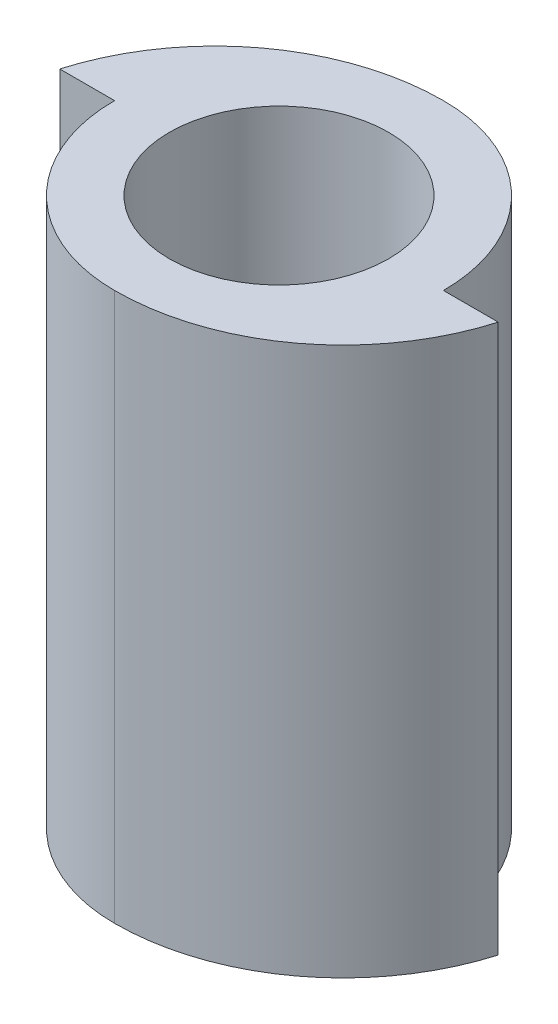
ISO-10303-21;
HEADER;
FILE_DESCRIPTION(('STEP AP214'),'2;1');
FILE_NAME('part.step','',(''),(''),'','','');
FILE_SCHEMA(('AUTOMOTIVE_DESIGN { 1 0 10303 214 1 1 1 1 }'));
ENDSEC;
DATA;
#1=APPLICATION_CONTEXT('core data for automotive mechanical design processes');
#2=APPLICATION_PROTOCOL_DEFINITION('international standard','automotive_design',2000,#1);
#3=PRODUCT_CONTEXT('',#1,'mechanical');
#4=PRODUCT('Part','Part','',(#3));
#5=PRODUCT_RELATED_PRODUCT_CATEGORY('part','',(#4));
#6=PRODUCT_DEFINITION_FORMATION('','',#4);
#7=PRODUCT_DEFINITION_CONTEXT('part definition',#1,'design');
#8=PRODUCT_DEFINITION('design','',#6,#7);
#9=PRODUCT_DEFINITION_SHAPE('','',#8);
#10=(LENGTH_UNIT() NAMED_UNIT(*) SI_UNIT(.MILLI.,.METRE.));
#11=(NAMED_UNIT(*) PLANE_ANGLE_UNIT() SI_UNIT($,.RADIAN.));
#12=(NAMED_UNIT(*) SI_UNIT($,.STERADIAN.) SOLID_ANGLE_UNIT());
#13=UNCERTAINTY_MEASURE_WITH_UNIT(LENGTH_MEASURE(1.E-05),#10,'distance_accuracy_value','');
#14=(GEOMETRIC_REPRESENTATION_CONTEXT(3) GLOBAL_UNCERTAINTY_ASSIGNED_CONTEXT((#13)) GLOBAL_UNIT_ASSIGNED_CONTEXT((#10,
#11,#12)) REPRESENTATION_CONTEXT('',''));
#15=CARTESIAN_POINT('',(0.,0.,0.));
#16=DIRECTION('',(0.,0.,1.));
#17=DIRECTION('',(1.,0.,0.));
#18=AXIS2_PLACEMENT_3D('',#15,#16,#17);
#19=CARTESIAN_POINT('',(0.,5.,0.));
#20=DIRECTION('',(0.,-1.,0.));
#21=DIRECTION('',(0.,0.,-1.));
#22=AXIS2_PLACEMENT_3D('',#19,#20,#21);
#23=CYLINDRICAL_SURFACE('',#22,1.5);
#24=CARTESIAN_POINT('',(0.,0.,0.));
#25=DIRECTION('',(0.,1.,0.));
#26=DIRECTION('',(0.,0.,1.));
#27=AXIS2_PLACEMENT_3D('',#24,#25,#26);
#28=CIRCLE('',#27,1.5);
#29=CARTESIAN_POINT('',(1.5,0.,0.));
#30=VERTEX_POINT('',#29);
#31=CARTESIAN_POINT('',(0.,0.,-1.5));
#32=VERTEX_POINT('',#31);
#33=EDGE_CURVE('E138',#30,#32,#28,.T.);
#34=ORIENTED_EDGE('',*,*,#33,.T.);
#35=DIRECTION('',(0.,-1.,0.));
#36=VECTOR('',#35,1.);
#37=CARTESIAN_POINT('',(0.,5.,-1.5));
#38=LINE('',#37,#36);
#39=CARTESIAN_POINT('',(0.,5.,-1.5));
#40=VERTEX_POINT('',#39);
#41=EDGE_CURVE('E11',#40,#32,#38,.T.);
#42=ORIENTED_EDGE('',*,*,#41,.F.);
#43=CARTESIAN_POINT('',(0.,5.,0.));
#44=DIRECTION('',(0.,1.,0.));
#45=DIRECTION('',(0.,0.,1.));
#46=AXIS2_PLACEMENT_3D('',#43,#44,#45);
#47=CIRCLE('',#46,1.5);
#48=CARTESIAN_POINT('',(1.5,5.,0.));
#49=VERTEX_POINT('',#48);
#50=EDGE_CURVE('E283',#49,#40,#47,.T.);
#51=ORIENTED_EDGE('',*,*,#50,.F.);
#52=DIRECTION('',(0.,-1.,0.));
#53=VECTOR('',#52,1.);
#54=CARTESIAN_POINT('',(1.5,5.,0.));
#55=LINE('',#54,#53);
#56=EDGE_CURVE('E61',#49,#30,#55,.T.);
#57=ORIENTED_EDGE('',*,*,#56,.T.);
#58=EDGE_LOOP('',(#34,#42,#51,#57));
#59=FACE_BOUND('',#58,.T.);
#60=ADVANCED_FACE('F43',(#59),#23,.T.);
#61=CARTESIAN_POINT('',(0.,5.,0.583333333333334));
#62=DIRECTION('',(0.,-1.,0.));
#63=DIRECTION('',(0.,0.,-1.));
#64=AXIS2_PLACEMENT_3D('',#61,#62,#63);
#65=CYLINDRICAL_SURFACE('',#64,2.08333333333333);
#66=CARTESIAN_POINT('',(0.,0.,0.583333333333334));
#67=DIRECTION('',(0.,1.,0.));
#68=DIRECTION('',(0.,0.,1.));
#69=AXIS2_PLACEMENT_3D('',#66,#67,#68);
#70=CIRCLE('',#69,2.08333333333333);
#71=CARTESIAN_POINT('',(-2.,0.,0.));
#72=VERTEX_POINT('',#71);
#73=EDGE_CURVE('E141',#32,#72,#70,.T.);
#74=ORIENTED_EDGE('',*,*,#73,.T.);
#75=DIRECTION('',(0.,-1.,0.));
#76=VECTOR('',#75,1.);
#77=CARTESIAN_POINT('',(-2.,5.,0.));
#78=LINE('',#77,#76);
#79=CARTESIAN_POINT('',(-2.,5.,0.));
#80=VERTEX_POINT('',#79);
#81=EDGE_CURVE('E53',#80,#72,#78,.T.);
#82=ORIENTED_EDGE('',*,*,#81,.F.);
#83=CARTESIAN_POINT('',(0.,5.,0.583333333333334));
#84=DIRECTION('',(0.,1.,0.));
#85=DIRECTION('',(0.,0.,1.));
#86=AXIS2_PLACEMENT_3D('',#83,#84,#85);
#87=CIRCLE('',#86,2.08333333333333);
#88=EDGE_CURVE('E94',#40,#80,#87,.T.);
#89=ORIENTED_EDGE('',*,*,#88,.F.);
#90=ORIENTED_EDGE('',*,*,#41,.T.);
#91=EDGE_LOOP('',(#74,#82,#89,#90));
#92=FACE_BOUND('',#91,.T.);
#93=ADVANCED_FACE('F182',(#92),#65,.T.);
#94=CARTESIAN_POINT('',(0.,5.,0.));
#95=DIRECTION('',(0.,0.,-1.));
#96=DIRECTION('',(-1.,0.,0.));
#97=AXIS2_PLACEMENT_3D('',#94,#95,#96);
#98=PLANE('',#97);
#99=DIRECTION('',(1.,0.,0.));
#100=VECTOR('',#99,1.);
#101=CARTESIAN_POINT('',(0.,0.,0.));
#102=LINE('',#101,#100);
#103=CARTESIAN_POINT('',(-1.5,0.,0.));
#104=VERTEX_POINT('',#103);
#105=EDGE_CURVE('E144',#72,#104,#102,.T.);
#106=ORIENTED_EDGE('',*,*,#105,.T.);
#107=DIRECTION('',(0.,-1.,0.));
#108=VECTOR('',#107,1.);
#109=CARTESIAN_POINT('',(-1.5,5.,0.));
#110=LINE('',#109,#108);
#111=CARTESIAN_POINT('',(-1.5,5.,0.));
#112=VERTEX_POINT('',#111);
#113=EDGE_CURVE('E124',#112,#104,#110,.T.);
#114=ORIENTED_EDGE('',*,*,#113,.F.);
#115=DIRECTION('',(1.,0.,0.));
#116=VECTOR('',#115,1.);
#117=CARTESIAN_POINT('',(0.,5.,0.));
#118=LINE('',#117,#116);
#119=EDGE_CURVE('E110',#80,#112,#118,.T.);
#120=ORIENTED_EDGE('',*,*,#119,.F.);
#121=ORIENTED_EDGE('',*,*,#81,.T.);
#122=EDGE_LOOP('',(#106,#114,#120,#121));
#123=FACE_BOUND('',#122,.T.);
#124=ADVANCED_FACE('F166',(#123),#98,.F.);
#125=CARTESIAN_POINT('',(0.,5.,0.));
#126=DIRECTION('',(0.,-1.,0.));
#127=DIRECTION('',(0.,0.,-1.));
#128=AXIS2_PLACEMENT_3D('',#125,#126,#127);
#129=CYLINDRICAL_SURFACE('',#128,1.5);
#130=CARTESIAN_POINT('',(0.,0.,0.));
#131=DIRECTION('',(0.,1.,0.));
#132=DIRECTION('',(0.,0.,1.));
#133=AXIS2_PLACEMENT_3D('',#130,#131,#132);
#134=CIRCLE('',#133,1.5);
#135=CARTESIAN_POINT('',(0.,0.,1.5));
#136=VERTEX_POINT('',#135);
#137=EDGE_CURVE('E120',#104,#136,#134,.T.);
#138=ORIENTED_EDGE('',*,*,#137,.T.);
#139=DIRECTION('',(0.,-1.,0.));
#140=VECTOR('',#139,1.);
#141=CARTESIAN_POINT('',(0.,5.,1.5));
#142=LINE('',#141,#140);
#143=CARTESIAN_POINT('',(0.,5.,1.5));
#144=VERTEX_POINT('',#143);
#145=EDGE_CURVE('E117',#144,#136,#142,.T.);
#146=ORIENTED_EDGE('',*,*,#145,.F.);
#147=CARTESIAN_POINT('',(0.,5.,0.));
#148=DIRECTION('',(0.,1.,0.));
#149=DIRECTION('',(0.,0.,1.));
#150=AXIS2_PLACEMENT_3D('',#147,#148,#149);
#151=CIRCLE('',#150,1.5);
#152=EDGE_CURVE('E103',#112,#144,#151,.T.);
#153=ORIENTED_EDGE('',*,*,#152,.F.);
#154=ORIENTED_EDGE('',*,*,#113,.T.);
#155=EDGE_LOOP('',(#138,#146,#153,#154));
#156=FACE_BOUND('',#155,.T.);
#157=ADVANCED_FACE('F118',(#156),#129,.T.);
#158=CARTESIAN_POINT('',(0.,5.,-0.583333333333334));
#159=DIRECTION('',(0.,-1.,0.));
#160=DIRECTION('',(0.,0.,-1.));
#161=AXIS2_PLACEMENT_3D('',#158,#159,#160);
#162=CYLINDRICAL_SURFACE('',#161,2.08333333333333);
#163=CARTESIAN_POINT('',(0.,0.,-0.583333333333334));
#164=DIRECTION('',(0.,1.,0.));
#165=DIRECTION('',(0.,0.,1.));
#166=AXIS2_PLACEMENT_3D('',#163,#164,#165);
#167=CIRCLE('',#166,2.08333333333333);
#168=CARTESIAN_POINT('',(2.,0.,0.));
#169=VERTEX_POINT('',#168);
#170=EDGE_CURVE('E149',#136,#169,#167,.T.);
#171=ORIENTED_EDGE('',*,*,#170,.T.);
#172=DIRECTION('',(0.,-1.,0.));
#173=VECTOR('',#172,1.);
#174=CARTESIAN_POINT('',(2.,5.,0.));
#175=LINE('',#174,#173);
#176=CARTESIAN_POINT('',(2.,5.,0.));
#177=VERTEX_POINT('',#176);
#178=EDGE_CURVE('E82',#177,#169,#175,.T.);
#179=ORIENTED_EDGE('',*,*,#178,.F.);
#180=CARTESIAN_POINT('',(0.,5.,-0.583333333333334));
#181=DIRECTION('',(0.,1.,0.));
#182=DIRECTION('',(0.,0.,1.));
#183=AXIS2_PLACEMENT_3D('',#180,#181,#182);
#184=CIRCLE('',#183,2.08333333333333);
#185=EDGE_CURVE('E108',#144,#177,#184,.T.);
#186=ORIENTED_EDGE('',*,*,#185,.F.);
#187=ORIENTED_EDGE('',*,*,#145,.T.);
#188=EDGE_LOOP('',(#171,#179,#186,#187));
#189=FACE_BOUND('',#188,.T.);
#190=ADVANCED_FACE('F126',(#189),#162,.T.);
#191=CARTESIAN_POINT('',(0.,5.,0.));
#192=DIRECTION('',(0.,-1.,0.));
#193=DIRECTION('',(0.,0.,-1.));
#194=AXIS2_PLACEMENT_3D('',#191,#192,#193);
#195=CYLINDRICAL_SURFACE('',#194,1.);
#196=CARTESIAN_POINT('',(0.,5.,0.));
#197=DIRECTION('',(0.,1.,0.));
#198=DIRECTION('',(0.,0.,1.));
#199=AXIS2_PLACEMENT_3D('',#196,#197,#198);
#200=CIRCLE('',#199,1.);
#201=CARTESIAN_POINT('',(0.,5.,1.));
#202=VERTEX_POINT('',#201);
#203=EDGE_CURVE('E156',#202,#202,#200,.T.);
#204=ORIENTED_EDGE('',*,*,#203,.T.);
#205=EDGE_LOOP('',(#204));
#206=FACE_BOUND('',#205,.T.);
#207=CARTESIAN_POINT('',(0.,0.,0.));
#208=DIRECTION('',(0.,1.,0.));
#209=DIRECTION('',(0.,0.,1.));
#210=AXIS2_PLACEMENT_3D('',#207,#208,#209);
#211=CIRCLE('',#210,1.);
#212=CARTESIAN_POINT('',(0.,0.,1.));
#213=VERTEX_POINT('',#212);
#214=EDGE_CURVE('E134',#213,#213,#211,.T.);
#215=ORIENTED_EDGE('',*,*,#214,.F.);
#216=EDGE_LOOP('',(#215));
#217=FACE_BOUND('',#216,.T.);
#218=ADVANCED_FACE('F45',(#206,#217),#195,.F.);
#219=CARTESIAN_POINT('',(0.,5.,0.));
#220=DIRECTION('',(0.,0.,-1.));
#221=DIRECTION('',(-1.,0.,0.));
#222=AXIS2_PLACEMENT_3D('',#219,#220,#221);
#223=PLANE('',#222);
#224=DIRECTION('',(1.,0.,0.));
#225=VECTOR('',#224,1.);
#226=CARTESIAN_POINT('',(0.,0.,0.));
#227=LINE('',#226,#225);
#228=EDGE_CURVE('E152',#30,#169,#227,.T.);
#229=ORIENTED_EDGE('',*,*,#228,.F.);
#230=ORIENTED_EDGE('',*,*,#56,.F.);
#231=DIRECTION('',(1.,0.,0.));
#232=VECTOR('',#231,1.);
#233=CARTESIAN_POINT('',(0.,5.,0.));
#234=LINE('',#233,#232);
#235=EDGE_CURVE('E128',#49,#177,#234,.T.);
#236=ORIENTED_EDGE('',*,*,#235,.T.);
#237=ORIENTED_EDGE('',*,*,#178,.T.);
#238=EDGE_LOOP('',(#229,#230,#236,#237));
#239=FACE_BOUND('',#238,.T.);
#240=ADVANCED_FACE('F169',(#239),#223,.T.);
#241=CARTESIAN_POINT('',(0.,5.,0.));
#242=DIRECTION('',(0.,1.,0.));
#243=DIRECTION('',(0.,0.,1.));
#244=AXIS2_PLACEMENT_3D('',#241,#242,#243);
#245=PLANE('',#244);
#246=ORIENTED_EDGE('',*,*,#203,.F.);
#247=EDGE_LOOP('',(#246));
#248=FACE_BOUND('',#247,.T.);
#249=ORIENTED_EDGE('',*,*,#50,.T.);
#250=ORIENTED_EDGE('',*,*,#88,.T.);
#251=ORIENTED_EDGE('',*,*,#119,.T.);
#252=ORIENTED_EDGE('',*,*,#152,.T.);
#253=ORIENTED_EDGE('',*,*,#185,.T.);
#254=ORIENTED_EDGE('',*,*,#235,.F.);
#255=EDGE_LOOP('',(#249,#250,#251,#252,#253,#254));
#256=FACE_BOUND('',#255,.T.);
#257=ADVANCED_FACE('F105',(#248,#256),#245,.T.);
#258=CARTESIAN_POINT('',(0.,0.,0.));
#259=DIRECTION('',(0.,1.,0.));
#260=DIRECTION('',(0.,0.,1.));
#261=AXIS2_PLACEMENT_3D('',#258,#259,#260);
#262=PLANE('',#261);
#263=ORIENTED_EDGE('',*,*,#214,.T.);
#264=EDGE_LOOP('',(#263));
#265=FACE_BOUND('',#264,.T.);
#266=ORIENTED_EDGE('',*,*,#33,.F.);
#267=ORIENTED_EDGE('',*,*,#228,.T.);
#268=ORIENTED_EDGE('',*,*,#170,.F.);
#269=ORIENTED_EDGE('',*,*,#137,.F.);
#270=ORIENTED_EDGE('',*,*,#105,.F.);
#271=ORIENTED_EDGE('',*,*,#73,.F.);
#272=EDGE_LOOP('',(#266,#267,#268,#269,#270,#271));
#273=FACE_BOUND('',#272,.T.);
#274=ADVANCED_FACE('F168',(#265,#273),#262,.F.);
#275=CLOSED_SHELL('',(#60,#93,#124,#157,#190,#218,#240,#257,#274));
#276=MANIFOLD_SOLID_BREP('B2',#275);
#277=ADVANCED_BREP_SHAPE_REPRESENTATION('',(#18,#276),#14);
#278=SHAPE_DEFINITION_REPRESENTATION(#9,#277);
ENDSEC;
END-ISO-10303-21;
